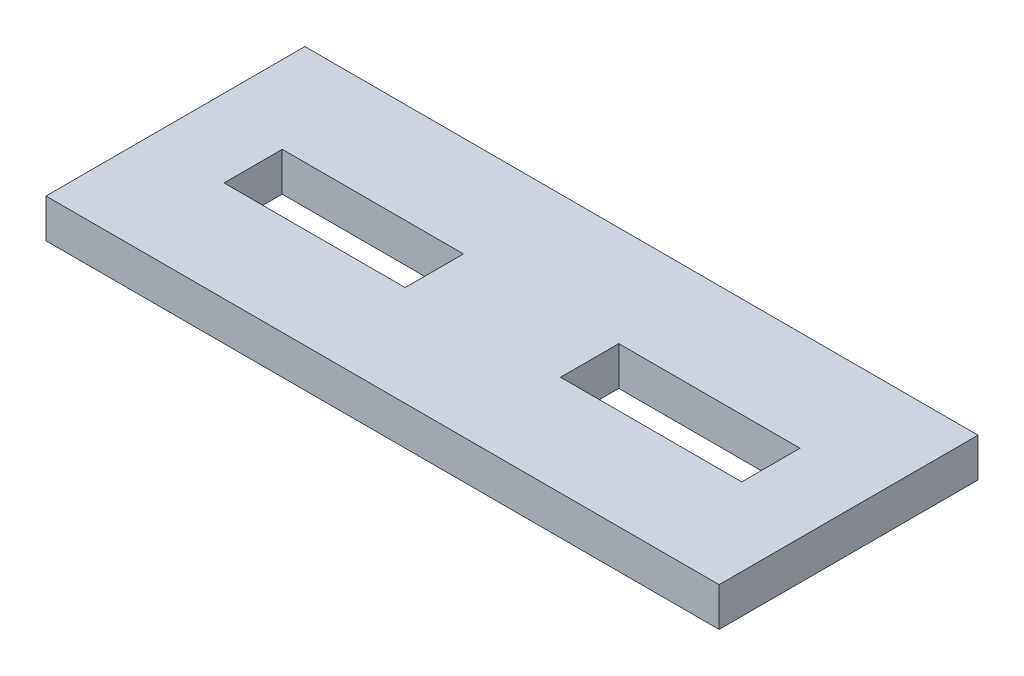
ISO-10303-21;
HEADER;
FILE_DESCRIPTION(('STEP AP214'),'2;1');
FILE_NAME('part.step','',(''),(''),'','','');
FILE_SCHEMA(('AUTOMOTIVE_DESIGN { 1 0 10303 214 1 1 1 1 }'));
ENDSEC;
DATA;
#1=APPLICATION_CONTEXT('core data for automotive mechanical design processes');
#2=APPLICATION_PROTOCOL_DEFINITION('international standard','automotive_design',2000,#1);
#3=PRODUCT_CONTEXT('',#1,'mechanical');
#4=PRODUCT('Part','Part','',(#3));
#5=PRODUCT_RELATED_PRODUCT_CATEGORY('part','',(#4));
#6=PRODUCT_DEFINITION_FORMATION('','',#4);
#7=PRODUCT_DEFINITION_CONTEXT('part definition',#1,'design');
#8=PRODUCT_DEFINITION('design','',#6,#7);
#9=PRODUCT_DEFINITION_SHAPE('','',#8);
#10=(LENGTH_UNIT() NAMED_UNIT(*) SI_UNIT(.MILLI.,.METRE.));
#11=(NAMED_UNIT(*) PLANE_ANGLE_UNIT() SI_UNIT($,.RADIAN.));
#12=(NAMED_UNIT(*) SI_UNIT($,.STERADIAN.) SOLID_ANGLE_UNIT());
#13=UNCERTAINTY_MEASURE_WITH_UNIT(LENGTH_MEASURE(1.E-05),#10,'distance_accuracy_value','');
#14=(GEOMETRIC_REPRESENTATION_CONTEXT(3) GLOBAL_UNCERTAINTY_ASSIGNED_CONTEXT((#13)) GLOBAL_UNIT_ASSIGNED_CONTEXT((#10,
#11,#12)) REPRESENTATION_CONTEXT('',''));
#15=CARTESIAN_POINT('',(0.,0.,0.));
#16=DIRECTION('',(0.,0.,1.));
#17=DIRECTION('',(1.,0.,0.));
#18=AXIS2_PLACEMENT_3D('',#15,#16,#17);
#19=CARTESIAN_POINT('',(0.,3.,0.));
#20=DIRECTION('',(0.,-1.,0.));
#21=DIRECTION('',(0.,0.,-1.));
#22=AXIS2_PLACEMENT_3D('',#19,#20,#21);
#23=PLANE('',#22);
#24=DIRECTION('',(0.,0.,1.));
#25=VECTOR('',#24,1.);
#26=CARTESIAN_POINT('',(-20.,3.,2.25));
#27=LINE('',#26,#25);
#28=CARTESIAN_POINT('',(-20.,3.,-2.25));
#29=VERTEX_POINT('',#28);
#30=CARTESIAN_POINT('',(-20.,3.,2.25));
#31=VERTEX_POINT('',#30);
#32=EDGE_CURVE('E163',#29,#31,#27,.T.);
#33=ORIENTED_EDGE('',*,*,#32,.F.);
#34=DIRECTION('',(-1.,0.,0.));
#35=VECTOR('',#34,1.);
#36=CARTESIAN_POINT('',(-20.,3.,-2.25));
#37=LINE('',#36,#35);
#38=CARTESIAN_POINT('',(-6.,3.,-2.25));
#39=VERTEX_POINT('',#38);
#40=EDGE_CURVE('E175',#39,#29,#37,.T.);
#41=ORIENTED_EDGE('',*,*,#40,.F.);
#42=DIRECTION('',(0.,0.,-1.));
#43=VECTOR('',#42,1.);
#44=CARTESIAN_POINT('',(-6.,3.,2.25));
#45=LINE('',#44,#43);
#46=CARTESIAN_POINT('',(-6.,3.,2.25));
#47=VERTEX_POINT('',#46);
#48=EDGE_CURVE('E170',#47,#39,#45,.T.);
#49=ORIENTED_EDGE('',*,*,#48,.F.);
#50=DIRECTION('',(1.,0.,0.));
#51=VECTOR('',#50,1.);
#52=CARTESIAN_POINT('',(-20.,3.,2.25));
#53=LINE('',#52,#51);
#54=EDGE_CURVE('E168',#31,#47,#53,.T.);
#55=ORIENTED_EDGE('',*,*,#54,.F.);
#56=EDGE_LOOP('',(#33,#41,#49,#55));
#57=FACE_BOUND('',#56,.T.);
#58=DIRECTION('',(0.,0.,1.));
#59=VECTOR('',#58,1.);
#60=CARTESIAN_POINT('',(-26.,3.,10.));
#61=LINE('',#60,#59);
#62=CARTESIAN_POINT('',(-26.,3.,-10.));
#63=VERTEX_POINT('',#62);
#64=CARTESIAN_POINT('',(-26.,3.,10.));
#65=VERTEX_POINT('',#64);
#66=EDGE_CURVE('E193',#63,#65,#61,.T.);
#67=ORIENTED_EDGE('',*,*,#66,.T.);
#68=DIRECTION('',(1.,0.,0.));
#69=VECTOR('',#68,1.);
#70=CARTESIAN_POINT('',(-26.,3.,10.));
#71=LINE('',#70,#69);
#72=CARTESIAN_POINT('',(26.,3.,10.));
#73=VERTEX_POINT('',#72);
#74=EDGE_CURVE('E199',#65,#73,#71,.T.);
#75=ORIENTED_EDGE('',*,*,#74,.T.);
#76=DIRECTION('',(0.,0.,-1.));
#77=VECTOR('',#76,1.);
#78=CARTESIAN_POINT('',(26.,3.,10.));
#79=LINE('',#78,#77);
#80=CARTESIAN_POINT('',(26.,3.,-10.));
#81=VERTEX_POINT('',#80);
#82=EDGE_CURVE('E202',#73,#81,#79,.T.);
#83=ORIENTED_EDGE('',*,*,#82,.T.);
#84=DIRECTION('',(-1.,0.,0.));
#85=VECTOR('',#84,1.);
#86=CARTESIAN_POINT('',(-26.,3.,-10.));
#87=LINE('',#86,#85);
#88=EDGE_CURVE('E201',#81,#63,#87,.T.);
#89=ORIENTED_EDGE('',*,*,#88,.T.);
#90=EDGE_LOOP('',(#67,#75,#83,#89));
#91=FACE_BOUND('',#90,.T.);
#92=DIRECTION('',(0.,0.,1.));
#93=VECTOR('',#92,1.);
#94=CARTESIAN_POINT('',(6.,3.,2.25));
#95=LINE('',#94,#93);
#96=CARTESIAN_POINT('',(6.,3.,-2.25));
#97=VERTEX_POINT('',#96);
#98=CARTESIAN_POINT('',(6.,3.,2.25));
#99=VERTEX_POINT('',#98);
#100=EDGE_CURVE('E126',#97,#99,#95,.T.);
#101=ORIENTED_EDGE('',*,*,#100,.F.);
#102=DIRECTION('',(-1.,0.,0.));
#103=VECTOR('',#102,1.);
#104=CARTESIAN_POINT('',(6.,3.,-2.25));
#105=LINE('',#104,#103);
#106=CARTESIAN_POINT('',(20.,3.,-2.25));
#107=VERTEX_POINT('',#106);
#108=EDGE_CURVE('E148',#107,#97,#105,.T.);
#109=ORIENTED_EDGE('',*,*,#108,.F.);
#110=DIRECTION('',(0.,0.,-1.));
#111=VECTOR('',#110,1.);
#112=CARTESIAN_POINT('',(20.,3.,2.25));
#113=LINE('',#112,#111);
#114=CARTESIAN_POINT('',(20.,3.,2.25));
#115=VERTEX_POINT('',#114);
#116=EDGE_CURVE('E149',#115,#107,#113,.T.);
#117=ORIENTED_EDGE('',*,*,#116,.F.);
#118=DIRECTION('',(1.,0.,0.));
#119=VECTOR('',#118,1.);
#120=CARTESIAN_POINT('',(6.,3.,2.25));
#121=LINE('',#120,#119);
#122=EDGE_CURVE('E136',#99,#115,#121,.T.);
#123=ORIENTED_EDGE('',*,*,#122,.F.);
#124=EDGE_LOOP('',(#101,#109,#117,#123));
#125=FACE_BOUND('',#124,.T.);
#126=ADVANCED_FACE('F39',(#57,#91,#125),#23,.F.);
#127=CARTESIAN_POINT('',(0.,0.,0.));
#128=DIRECTION('',(0.,-1.,0.));
#129=DIRECTION('',(0.,0.,-1.));
#130=AXIS2_PLACEMENT_3D('',#127,#128,#129);
#131=PLANE('',#130);
#132=DIRECTION('',(0.,0.,1.));
#133=VECTOR('',#132,1.);
#134=CARTESIAN_POINT('',(-26.,0.,10.));
#135=LINE('',#134,#133);
#136=CARTESIAN_POINT('',(-26.,0.,-10.));
#137=VERTEX_POINT('',#136);
#138=CARTESIAN_POINT('',(-26.,0.,10.));
#139=VERTEX_POINT('',#138);
#140=EDGE_CURVE('E191',#137,#139,#135,.T.);
#141=ORIENTED_EDGE('',*,*,#140,.F.);
#142=DIRECTION('',(-1.,0.,0.));
#143=VECTOR('',#142,1.);
#144=CARTESIAN_POINT('',(-26.,0.,-10.));
#145=LINE('',#144,#143);
#146=CARTESIAN_POINT('',(26.,0.,-10.));
#147=VERTEX_POINT('',#146);
#148=EDGE_CURVE('E198',#147,#137,#145,.T.);
#149=ORIENTED_EDGE('',*,*,#148,.F.);
#150=DIRECTION('',(0.,0.,-1.));
#151=VECTOR('',#150,1.);
#152=CARTESIAN_POINT('',(26.,0.,10.));
#153=LINE('',#152,#151);
#154=CARTESIAN_POINT('',(26.,0.,10.));
#155=VERTEX_POINT('',#154);
#156=EDGE_CURVE('E210',#155,#147,#153,.T.);
#157=ORIENTED_EDGE('',*,*,#156,.F.);
#158=DIRECTION('',(1.,0.,0.));
#159=VECTOR('',#158,1.);
#160=CARTESIAN_POINT('',(-26.,0.,10.));
#161=LINE('',#160,#159);
#162=EDGE_CURVE('E209',#139,#155,#161,.T.);
#163=ORIENTED_EDGE('',*,*,#162,.F.);
#164=EDGE_LOOP('',(#141,#149,#157,#163));
#165=FACE_BOUND('',#164,.T.);
#166=DIRECTION('',(-1.,0.,0.));
#167=VECTOR('',#166,1.);
#168=CARTESIAN_POINT('',(-20.,0.,-2.25));
#169=LINE('',#168,#167);
#170=CARTESIAN_POINT('',(-6.,0.,-2.25));
#171=VERTEX_POINT('',#170);
#172=CARTESIAN_POINT('',(-20.,0.,-2.25));
#173=VERTEX_POINT('',#172);
#174=EDGE_CURVE('E167',#171,#173,#169,.T.);
#175=ORIENTED_EDGE('',*,*,#174,.T.);
#176=DIRECTION('',(0.,0.,1.));
#177=VECTOR('',#176,1.);
#178=CARTESIAN_POINT('',(-20.,0.,2.25));
#179=LINE('',#178,#177);
#180=CARTESIAN_POINT('',(-20.,0.,2.25));
#181=VERTEX_POINT('',#180);
#182=EDGE_CURVE('E143',#173,#181,#179,.T.);
#183=ORIENTED_EDGE('',*,*,#182,.T.);
#184=DIRECTION('',(1.,0.,0.));
#185=VECTOR('',#184,1.);
#186=CARTESIAN_POINT('',(-20.,0.,2.25));
#187=LINE('',#186,#185);
#188=CARTESIAN_POINT('',(-6.,0.,2.25));
#189=VERTEX_POINT('',#188);
#190=EDGE_CURVE('E180',#181,#189,#187,.T.);
#191=ORIENTED_EDGE('',*,*,#190,.T.);
#192=DIRECTION('',(0.,0.,-1.));
#193=VECTOR('',#192,1.);
#194=CARTESIAN_POINT('',(-6.,0.,2.25));
#195=LINE('',#194,#193);
#196=EDGE_CURVE('E179',#189,#171,#195,.T.);
#197=ORIENTED_EDGE('',*,*,#196,.T.);
#198=EDGE_LOOP('',(#175,#183,#191,#197));
#199=FACE_BOUND('',#198,.T.);
#200=DIRECTION('',(-1.,0.,0.));
#201=VECTOR('',#200,1.);
#202=CARTESIAN_POINT('',(6.,0.,-2.25));
#203=LINE('',#202,#201);
#204=CARTESIAN_POINT('',(20.,0.,-2.25));
#205=VERTEX_POINT('',#204);
#206=CARTESIAN_POINT('',(6.,0.,-2.25));
#207=VERTEX_POINT('',#206);
#208=EDGE_CURVE('E140',#205,#207,#203,.T.);
#209=ORIENTED_EDGE('',*,*,#208,.T.);
#210=DIRECTION('',(0.,0.,1.));
#211=VECTOR('',#210,1.);
#212=CARTESIAN_POINT('',(6.,0.,2.25));
#213=LINE('',#212,#211);
#214=CARTESIAN_POINT('',(6.,0.,2.25));
#215=VERTEX_POINT('',#214);
#216=EDGE_CURVE('E62',#207,#215,#213,.T.);
#217=ORIENTED_EDGE('',*,*,#216,.T.);
#218=DIRECTION('',(1.,0.,0.));
#219=VECTOR('',#218,1.);
#220=CARTESIAN_POINT('',(6.,0.,2.25));
#221=LINE('',#220,#219);
#222=CARTESIAN_POINT('',(20.,0.,2.25));
#223=VERTEX_POINT('',#222);
#224=EDGE_CURVE('E142',#215,#223,#221,.T.);
#225=ORIENTED_EDGE('',*,*,#224,.T.);
#226=DIRECTION('',(0.,0.,-1.));
#227=VECTOR('',#226,1.);
#228=CARTESIAN_POINT('',(20.,0.,2.25));
#229=LINE('',#228,#227);
#230=EDGE_CURVE('E157',#223,#205,#229,.T.);
#231=ORIENTED_EDGE('',*,*,#230,.T.);
#232=EDGE_LOOP('',(#209,#217,#225,#231));
#233=FACE_BOUND('',#232,.T.);
#234=ADVANCED_FACE('F228',(#165,#199,#233),#131,.T.);
#235=CARTESIAN_POINT('',(-26.,3.,10.));
#236=DIRECTION('',(1.,0.,0.));
#237=DIRECTION('',(0.,0.,-1.));
#238=AXIS2_PLACEMENT_3D('',#235,#236,#237);
#239=PLANE('',#238);
#240=ORIENTED_EDGE('',*,*,#140,.T.);
#241=DIRECTION('',(0.,-1.,0.));
#242=VECTOR('',#241,1.);
#243=CARTESIAN_POINT('',(-26.,3.,10.));
#244=LINE('',#243,#242);
#245=EDGE_CURVE('E11',#65,#139,#244,.T.);
#246=ORIENTED_EDGE('',*,*,#245,.F.);
#247=ORIENTED_EDGE('',*,*,#66,.F.);
#248=DIRECTION('',(0.,-1.,0.));
#249=VECTOR('',#248,1.);
#250=CARTESIAN_POINT('',(-26.,3.,-10.));
#251=LINE('',#250,#249);
#252=EDGE_CURVE('E203',#63,#137,#251,.T.);
#253=ORIENTED_EDGE('',*,*,#252,.T.);
#254=EDGE_LOOP('',(#240,#246,#247,#253));
#255=FACE_BOUND('',#254,.T.);
#256=ADVANCED_FACE('F41',(#255),#239,.F.);
#257=CARTESIAN_POINT('',(-26.,3.,10.));
#258=DIRECTION('',(0.,0.,-1.));
#259=DIRECTION('',(-1.,0.,0.));
#260=AXIS2_PLACEMENT_3D('',#257,#258,#259);
#261=PLANE('',#260);
#262=ORIENTED_EDGE('',*,*,#162,.T.);
#263=DIRECTION('',(0.,-1.,0.));
#264=VECTOR('',#263,1.);
#265=CARTESIAN_POINT('',(26.,3.,10.));
#266=LINE('',#265,#264);
#267=EDGE_CURVE('E50',#73,#155,#266,.T.);
#268=ORIENTED_EDGE('',*,*,#267,.F.);
#269=ORIENTED_EDGE('',*,*,#74,.F.);
#270=ORIENTED_EDGE('',*,*,#245,.T.);
#271=EDGE_LOOP('',(#262,#268,#269,#270));
#272=FACE_BOUND('',#271,.T.);
#273=ADVANCED_FACE('F239',(#272),#261,.F.);
#274=CARTESIAN_POINT('',(26.,3.,10.));
#275=DIRECTION('',(-1.,0.,0.));
#276=DIRECTION('',(0.,0.,1.));
#277=AXIS2_PLACEMENT_3D('',#274,#275,#276);
#278=PLANE('',#277);
#279=ORIENTED_EDGE('',*,*,#156,.T.);
#280=DIRECTION('',(0.,-1.,0.));
#281=VECTOR('',#280,1.);
#282=CARTESIAN_POINT('',(26.,3.,-10.));
#283=LINE('',#282,#281);
#284=EDGE_CURVE('E214',#81,#147,#283,.T.);
#285=ORIENTED_EDGE('',*,*,#284,.F.);
#286=ORIENTED_EDGE('',*,*,#82,.F.);
#287=ORIENTED_EDGE('',*,*,#267,.T.);
#288=EDGE_LOOP('',(#279,#285,#286,#287));
#289=FACE_BOUND('',#288,.T.);
#290=ADVANCED_FACE('F225',(#289),#278,.F.);
#291=CARTESIAN_POINT('',(-26.,3.,-10.));
#292=DIRECTION('',(0.,0.,1.));
#293=DIRECTION('',(1.,0.,0.));
#294=AXIS2_PLACEMENT_3D('',#291,#292,#293);
#295=PLANE('',#294);
#296=ORIENTED_EDGE('',*,*,#148,.T.);
#297=ORIENTED_EDGE('',*,*,#252,.F.);
#298=ORIENTED_EDGE('',*,*,#88,.F.);
#299=ORIENTED_EDGE('',*,*,#284,.T.);
#300=EDGE_LOOP('',(#296,#297,#298,#299));
#301=FACE_BOUND('',#300,.T.);
#302=ADVANCED_FACE('F235',(#301),#295,.F.);
#303=CARTESIAN_POINT('',(-20.,3.,2.25));
#304=DIRECTION('',(1.,0.,0.));
#305=DIRECTION('',(0.,0.,-1.));
#306=AXIS2_PLACEMENT_3D('',#303,#304,#305);
#307=PLANE('',#306);
#308=ORIENTED_EDGE('',*,*,#182,.F.);
#309=DIRECTION('',(0.,-1.,0.));
#310=VECTOR('',#309,1.);
#311=CARTESIAN_POINT('',(-20.,3.,-2.25));
#312=LINE('',#311,#310);
#313=EDGE_CURVE('E174',#29,#173,#312,.T.);
#314=ORIENTED_EDGE('',*,*,#313,.F.);
#315=ORIENTED_EDGE('',*,*,#32,.T.);
#316=DIRECTION('',(0.,-1.,0.));
#317=VECTOR('',#316,1.);
#318=CARTESIAN_POINT('',(-20.,3.,2.25));
#319=LINE('',#318,#317);
#320=EDGE_CURVE('E192',#31,#181,#319,.T.);
#321=ORIENTED_EDGE('',*,*,#320,.T.);
#322=EDGE_LOOP('',(#308,#314,#315,#321));
#323=FACE_BOUND('',#322,.T.);
#324=ADVANCED_FACE('F253',(#323),#307,.T.);
#325=CARTESIAN_POINT('',(-20.,3.,2.25));
#326=DIRECTION('',(0.,0.,-1.));
#327=DIRECTION('',(-1.,0.,0.));
#328=AXIS2_PLACEMENT_3D('',#325,#326,#327);
#329=PLANE('',#328);
#330=ORIENTED_EDGE('',*,*,#190,.F.);
#331=ORIENTED_EDGE('',*,*,#320,.F.);
#332=ORIENTED_EDGE('',*,*,#54,.T.);
#333=DIRECTION('',(0.,-1.,0.));
#334=VECTOR('',#333,1.);
#335=CARTESIAN_POINT('',(-6.,3.,2.25));
#336=LINE('',#335,#334);
#337=EDGE_CURVE('E188',#47,#189,#336,.T.);
#338=ORIENTED_EDGE('',*,*,#337,.T.);
#339=EDGE_LOOP('',(#330,#331,#332,#338));
#340=FACE_BOUND('',#339,.T.);
#341=ADVANCED_FACE('F263',(#340),#329,.T.);
#342=CARTESIAN_POINT('',(-6.,3.,2.25));
#343=DIRECTION('',(-1.,0.,0.));
#344=DIRECTION('',(0.,0.,1.));
#345=AXIS2_PLACEMENT_3D('',#342,#343,#344);
#346=PLANE('',#345);
#347=ORIENTED_EDGE('',*,*,#196,.F.);
#348=ORIENTED_EDGE('',*,*,#337,.F.);
#349=ORIENTED_EDGE('',*,*,#48,.T.);
#350=DIRECTION('',(0.,-1.,0.));
#351=VECTOR('',#350,1.);
#352=CARTESIAN_POINT('',(-6.,3.,-2.25));
#353=LINE('',#352,#351);
#354=EDGE_CURVE('E190',#39,#171,#353,.T.);
#355=ORIENTED_EDGE('',*,*,#354,.T.);
#356=EDGE_LOOP('',(#347,#348,#349,#355));
#357=FACE_BOUND('',#356,.T.);
#358=ADVANCED_FACE('F266',(#357),#346,.T.);
#359=CARTESIAN_POINT('',(-20.,3.,-2.25));
#360=DIRECTION('',(0.,0.,1.));
#361=DIRECTION('',(1.,0.,0.));
#362=AXIS2_PLACEMENT_3D('',#359,#360,#361);
#363=PLANE('',#362);
#364=ORIENTED_EDGE('',*,*,#174,.F.);
#365=ORIENTED_EDGE('',*,*,#354,.F.);
#366=ORIENTED_EDGE('',*,*,#40,.T.);
#367=ORIENTED_EDGE('',*,*,#313,.T.);
#368=EDGE_LOOP('',(#364,#365,#366,#367));
#369=FACE_BOUND('',#368,.T.);
#370=ADVANCED_FACE('F275',(#369),#363,.T.);
#371=CARTESIAN_POINT('',(6.,3.,2.25));
#372=DIRECTION('',(1.,0.,0.));
#373=DIRECTION('',(0.,0.,-1.));
#374=AXIS2_PLACEMENT_3D('',#371,#372,#373);
#375=PLANE('',#374);
#376=ORIENTED_EDGE('',*,*,#216,.F.);
#377=DIRECTION('',(0.,-1.,0.));
#378=VECTOR('',#377,1.);
#379=CARTESIAN_POINT('',(6.,3.,-2.25));
#380=LINE('',#379,#378);
#381=EDGE_CURVE('E135',#97,#207,#380,.T.);
#382=ORIENTED_EDGE('',*,*,#381,.F.);
#383=ORIENTED_EDGE('',*,*,#100,.T.);
#384=DIRECTION('',(0.,-1.,0.));
#385=VECTOR('',#384,1.);
#386=CARTESIAN_POINT('',(6.,3.,2.25));
#387=LINE('',#386,#385);
#388=EDGE_CURVE('E131',#99,#215,#387,.T.);
#389=ORIENTED_EDGE('',*,*,#388,.T.);
#390=EDGE_LOOP('',(#376,#382,#383,#389));
#391=FACE_BOUND('',#390,.T.);
#392=ADVANCED_FACE('F127',(#391),#375,.T.);
#393=CARTESIAN_POINT('',(6.,3.,2.25));
#394=DIRECTION('',(0.,0.,-1.));
#395=DIRECTION('',(-1.,0.,0.));
#396=AXIS2_PLACEMENT_3D('',#393,#394,#395);
#397=PLANE('',#396);
#398=ORIENTED_EDGE('',*,*,#224,.F.);
#399=ORIENTED_EDGE('',*,*,#388,.F.);
#400=ORIENTED_EDGE('',*,*,#122,.T.);
#401=DIRECTION('',(0.,-1.,0.));
#402=VECTOR('',#401,1.);
#403=CARTESIAN_POINT('',(20.,3.,2.25));
#404=LINE('',#403,#402);
#405=EDGE_CURVE('E144',#115,#223,#404,.T.);
#406=ORIENTED_EDGE('',*,*,#405,.T.);
#407=EDGE_LOOP('',(#398,#399,#400,#406));
#408=FACE_BOUND('',#407,.T.);
#409=ADVANCED_FACE('F139',(#408),#397,.T.);
#410=CARTESIAN_POINT('',(20.,3.,2.25));
#411=DIRECTION('',(-1.,0.,0.));
#412=DIRECTION('',(0.,0.,1.));
#413=AXIS2_PLACEMENT_3D('',#410,#411,#412);
#414=PLANE('',#413);
#415=ORIENTED_EDGE('',*,*,#230,.F.);
#416=ORIENTED_EDGE('',*,*,#405,.F.);
#417=ORIENTED_EDGE('',*,*,#116,.T.);
#418=DIRECTION('',(0.,-1.,0.));
#419=VECTOR('',#418,1.);
#420=CARTESIAN_POINT('',(20.,3.,-2.25));
#421=LINE('',#420,#419);
#422=EDGE_CURVE('E53',#107,#205,#421,.T.);
#423=ORIENTED_EDGE('',*,*,#422,.T.);
#424=EDGE_LOOP('',(#415,#416,#417,#423));
#425=FACE_BOUND('',#424,.T.);
#426=ADVANCED_FACE('F292',(#425),#414,.T.);
#427=CARTESIAN_POINT('',(6.,3.,-2.25));
#428=DIRECTION('',(0.,0.,1.));
#429=DIRECTION('',(1.,0.,0.));
#430=AXIS2_PLACEMENT_3D('',#427,#428,#429);
#431=PLANE('',#430);
#432=ORIENTED_EDGE('',*,*,#208,.F.);
#433=ORIENTED_EDGE('',*,*,#422,.F.);
#434=ORIENTED_EDGE('',*,*,#108,.T.);
#435=ORIENTED_EDGE('',*,*,#381,.T.);
#436=EDGE_LOOP('',(#432,#433,#434,#435));
#437=FACE_BOUND('',#436,.T.);
#438=ADVANCED_FACE('F294',(#437),#431,.T.);
#439=CLOSED_SHELL('',(#126,#234,#256,#273,#290,#302,#324,#341,#358,#370,#392,#409,#426,#438));
#440=MANIFOLD_SOLID_BREP('B2',#439);
#441=ADVANCED_BREP_SHAPE_REPRESENTATION('',(#18,#440),#14);
#442=SHAPE_DEFINITION_REPRESENTATION(#9,#441);
ENDSEC;
END-ISO-10303-21;
